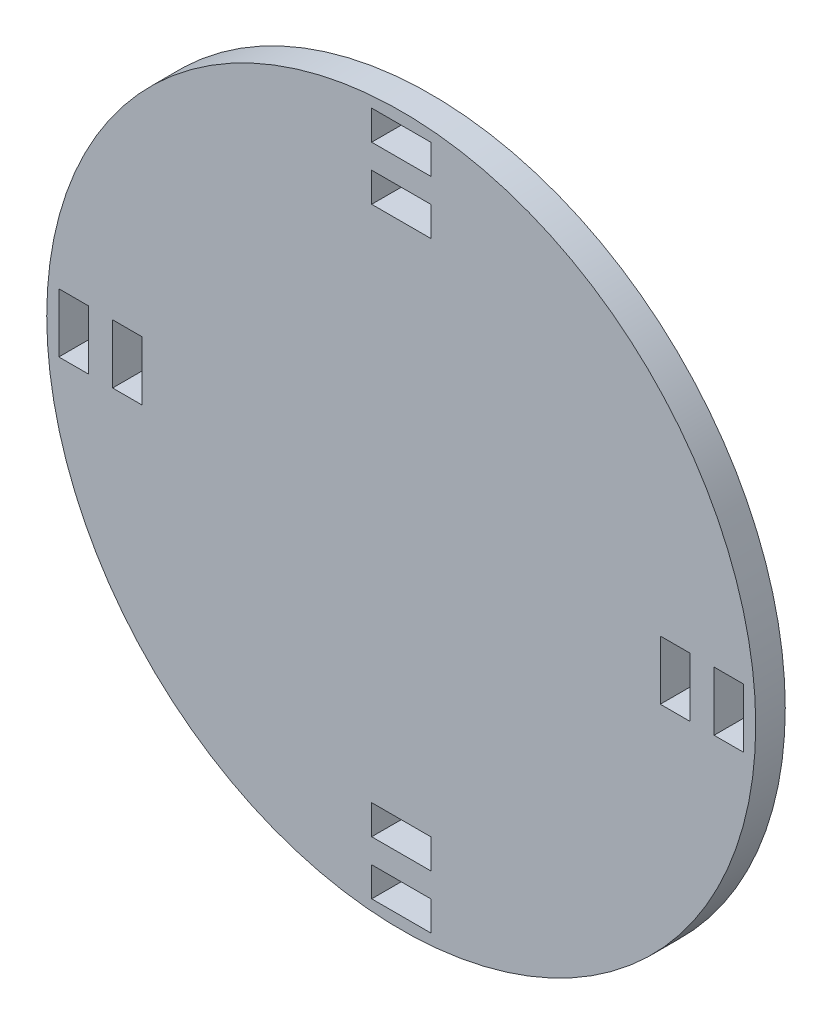
ISO-10303-21;
HEADER;
FILE_DESCRIPTION(('STEP AP214'),'2;1');
FILE_NAME('part.step','',(''),(''),'','','');
FILE_SCHEMA(('AUTOMOTIVE_DESIGN { 1 0 10303 214 1 1 1 1 }'));
ENDSEC;
DATA;
#1=APPLICATION_CONTEXT('core data for automotive mechanical design processes');
#2=APPLICATION_PROTOCOL_DEFINITION('international standard','automotive_design',2000,#1);
#3=PRODUCT_CONTEXT('',#1,'mechanical');
#4=PRODUCT('Part','Part','',(#3));
#5=PRODUCT_RELATED_PRODUCT_CATEGORY('part','',(#4));
#6=PRODUCT_DEFINITION_FORMATION('','',#4);
#7=PRODUCT_DEFINITION_CONTEXT('part definition',#1,'design');
#8=PRODUCT_DEFINITION('design','',#6,#7);
#9=PRODUCT_DEFINITION_SHAPE('','',#8);
#10=(LENGTH_UNIT() NAMED_UNIT(*) SI_UNIT(.MILLI.,.METRE.));
#11=(NAMED_UNIT(*) PLANE_ANGLE_UNIT() SI_UNIT($,.RADIAN.));
#12=(NAMED_UNIT(*) SI_UNIT($,.STERADIAN.) SOLID_ANGLE_UNIT());
#13=UNCERTAINTY_MEASURE_WITH_UNIT(LENGTH_MEASURE(1.E-05),#10,'distance_accuracy_value','');
#14=(GEOMETRIC_REPRESENTATION_CONTEXT(3) GLOBAL_UNCERTAINTY_ASSIGNED_CONTEXT((#13)) GLOBAL_UNIT_ASSIGNED_CONTEXT((#10,
#11,#12)) REPRESENTATION_CONTEXT('',''));
#15=CARTESIAN_POINT('',(0.,0.,0.));
#16=DIRECTION('',(0.,0.,1.));
#17=DIRECTION('',(1.,0.,0.));
#18=AXIS2_PLACEMENT_3D('',#15,#16,#17);
#19=CARTESIAN_POINT('',(0.,0.,6.35));
#20=DIRECTION('',(0.,0.,1.));
#21=DIRECTION('',(1.,0.,0.));
#22=AXIS2_PLACEMENT_3D('',#19,#20,#21);
#23=PLANE('',#22);
#24=DIRECTION('',(1.,0.,0.));
#25=VECTOR('',#24,1.);
#26=CARTESIAN_POINT('',(-73.5965,-6.35000000000026,6.35));
#27=LINE('',#26,#25);
#28=CARTESIAN_POINT('',(-73.5965,-6.35000000000026,6.35));
#29=VERTEX_POINT('',#28);
#30=CARTESIAN_POINT('',(-67.2465,-6.35000000000023,6.35));
#31=VERTEX_POINT('',#30);
#32=EDGE_CURVE('E55',#29,#31,#27,.T.);
#33=ORIENTED_EDGE('',*,*,#32,.F.);
#34=DIRECTION('',(0.,-1.,0.));
#35=VECTOR('',#34,1.);
#36=CARTESIAN_POINT('',(-73.5965,-6.35000000000026,6.35));
#37=LINE('',#36,#35);
#38=CARTESIAN_POINT('',(-73.5965,6.34999999999974,6.35));
#39=VERTEX_POINT('',#38);
#40=EDGE_CURVE('E258',#39,#29,#37,.T.);
#41=ORIENTED_EDGE('',*,*,#40,.F.);
#42=DIRECTION('',(-1.,0.,0.));
#43=VECTOR('',#42,1.);
#44=CARTESIAN_POINT('',(-73.5965,6.34999999999974,6.35));
#45=LINE('',#44,#43);
#46=CARTESIAN_POINT('',(-67.2465,6.34999999999976,6.35));
#47=VERTEX_POINT('',#46);
#48=EDGE_CURVE('E286',#47,#39,#45,.T.);
#49=ORIENTED_EDGE('',*,*,#48,.F.);
#50=DIRECTION('',(0.,1.,0.));
#51=VECTOR('',#50,1.);
#52=CARTESIAN_POINT('',(-67.2465,-6.35000000000023,6.35));
#53=LINE('',#52,#51);
#54=EDGE_CURVE('E278',#31,#47,#53,.T.);
#55=ORIENTED_EDGE('',*,*,#54,.F.);
#56=EDGE_LOOP('',(#33,#41,#49,#55));
#57=FACE_BOUND('',#56,.T.);
#58=DIRECTION('',(-1.,0.,0.));
#59=VECTOR('',#58,1.);
#60=CARTESIAN_POINT('',(62.0394999999999,6.35000000000065,6.35));
#61=LINE('',#60,#59);
#62=CARTESIAN_POINT('',(62.0394999999999,6.35000000000065,6.35));
#63=VERTEX_POINT('',#62);
#64=CARTESIAN_POINT('',(55.6894999999999,6.35000000000058,6.35));
#65=VERTEX_POINT('',#64);
#66=EDGE_CURVE('E63',#63,#65,#61,.T.);
#67=ORIENTED_EDGE('',*,*,#66,.F.);
#68=DIRECTION('',(0.,1.,0.));
#69=VECTOR('',#68,1.);
#70=CARTESIAN_POINT('',(62.0394999999999,6.35000000000065,6.35));
#71=LINE('',#70,#69);
#72=CARTESIAN_POINT('',(62.0395000000001,-6.34999999999935,6.35));
#73=VERTEX_POINT('',#72);
#74=EDGE_CURVE('E321',#73,#63,#71,.T.);
#75=ORIENTED_EDGE('',*,*,#74,.F.);
#76=DIRECTION('',(1.,0.,0.));
#77=VECTOR('',#76,1.);
#78=CARTESIAN_POINT('',(62.0395000000001,-6.34999999999935,6.35));
#79=LINE('',#78,#77);
#80=CARTESIAN_POINT('',(55.6895000000001,-6.34999999999941,6.35));
#81=VERTEX_POINT('',#80);
#82=EDGE_CURVE('E317',#81,#73,#79,.T.);
#83=ORIENTED_EDGE('',*,*,#82,.F.);
#84=DIRECTION('',(0.,-1.,0.));
#85=VECTOR('',#84,1.);
#86=CARTESIAN_POINT('',(55.6894999999999,6.35000000000058,6.35));
#87=LINE('',#86,#85);
#88=EDGE_CURVE('E313',#65,#81,#87,.T.);
#89=ORIENTED_EDGE('',*,*,#88,.F.);
#90=EDGE_LOOP('',(#67,#75,#83,#89));
#91=FACE_BOUND('',#90,.T.);
#92=DIRECTION('',(1.,0.,0.));
#93=VECTOR('',#92,1.);
#94=CARTESIAN_POINT('',(-62.0395,-6.35000000000022,6.35));
#95=LINE('',#94,#93);
#96=CARTESIAN_POINT('',(-62.0395,-6.35000000000022,6.35));
#97=VERTEX_POINT('',#96);
#98=CARTESIAN_POINT('',(-55.6895,-6.35000000000019,6.35));
#99=VERTEX_POINT('',#98);
#100=EDGE_CURVE('E440',#97,#99,#95,.T.);
#101=ORIENTED_EDGE('',*,*,#100,.F.);
#102=DIRECTION('',(0.,-1.,0.));
#103=VECTOR('',#102,1.);
#104=CARTESIAN_POINT('',(-62.0395,-6.35000000000022,6.35));
#105=LINE('',#104,#103);
#106=CARTESIAN_POINT('',(-62.0395,6.34999999999978,6.35));
#107=VERTEX_POINT('',#106);
#108=EDGE_CURVE('E451',#107,#97,#105,.T.);
#109=ORIENTED_EDGE('',*,*,#108,.F.);
#110=DIRECTION('',(-1.,0.,0.));
#111=VECTOR('',#110,1.);
#112=CARTESIAN_POINT('',(-62.0395,6.34999999999978,6.35));
#113=LINE('',#112,#111);
#114=CARTESIAN_POINT('',(-55.6895,6.3499999999998,6.35));
#115=VERTEX_POINT('',#114);
#116=EDGE_CURVE('E447',#115,#107,#113,.T.);
#117=ORIENTED_EDGE('',*,*,#116,.F.);
#118=DIRECTION('',(0.,1.,0.));
#119=VECTOR('',#118,1.);
#120=CARTESIAN_POINT('',(-55.6895,-6.35000000000019,6.35));
#121=LINE('',#120,#119);
#122=EDGE_CURVE('E443',#99,#115,#121,.T.);
#123=ORIENTED_EDGE('',*,*,#122,.F.);
#124=EDGE_LOOP('',(#101,#109,#117,#123));
#125=FACE_BOUND('',#124,.T.);
#126=DIRECTION('',(0.,1.,0.));
#127=VECTOR('',#126,1.);
#128=CARTESIAN_POINT('',(6.35,-73.5965,6.35));
#129=LINE('',#128,#127);
#130=CARTESIAN_POINT('',(6.35,-73.5965,6.35));
#131=VERTEX_POINT('',#130);
#132=CARTESIAN_POINT('',(6.35,-67.2465,6.35));
#133=VERTEX_POINT('',#132);
#134=EDGE_CURVE('E482',#131,#133,#129,.T.);
#135=ORIENTED_EDGE('',*,*,#134,.F.);
#136=DIRECTION('',(1.,0.,0.));
#137=VECTOR('',#136,1.);
#138=CARTESIAN_POINT('',(6.35,-73.5965,6.35));
#139=LINE('',#138,#137);
#140=CARTESIAN_POINT('',(-6.35,-73.5965,6.35));
#141=VERTEX_POINT('',#140);
#142=EDGE_CURVE('E493',#141,#131,#139,.T.);
#143=ORIENTED_EDGE('',*,*,#142,.F.);
#144=DIRECTION('',(0.,-1.,0.));
#145=VECTOR('',#144,1.);
#146=CARTESIAN_POINT('',(-6.35,-73.5965,6.35));
#147=LINE('',#146,#145);
#148=CARTESIAN_POINT('',(-6.35,-67.2465,6.35));
#149=VERTEX_POINT('',#148);
#150=EDGE_CURVE('E489',#149,#141,#147,.T.);
#151=ORIENTED_EDGE('',*,*,#150,.F.);
#152=DIRECTION('',(-1.,0.,0.));
#153=VECTOR('',#152,1.);
#154=CARTESIAN_POINT('',(6.35,-67.2465,6.35));
#155=LINE('',#154,#153);
#156=EDGE_CURVE('E485',#133,#149,#155,.T.);
#157=ORIENTED_EDGE('',*,*,#156,.F.);
#158=EDGE_LOOP('',(#135,#143,#151,#157));
#159=FACE_BOUND('',#158,.T.);
#160=DIRECTION('',(0.,1.,0.));
#161=VECTOR('',#160,1.);
#162=CARTESIAN_POINT('',(6.35,-62.0395,6.35));
#163=LINE('',#162,#161);
#164=CARTESIAN_POINT('',(6.35,-62.0395,6.35));
#165=VERTEX_POINT('',#164);
#166=CARTESIAN_POINT('',(6.35,-55.6895,6.35));
#167=VERTEX_POINT('',#166);
#168=EDGE_CURVE('E354',#165,#167,#163,.T.);
#169=ORIENTED_EDGE('',*,*,#168,.F.);
#170=DIRECTION('',(1.,0.,0.));
#171=VECTOR('',#170,1.);
#172=CARTESIAN_POINT('',(6.35,-62.0395,6.35));
#173=LINE('',#172,#171);
#174=CARTESIAN_POINT('',(-6.35,-62.0395,6.35));
#175=VERTEX_POINT('',#174);
#176=EDGE_CURVE('E365',#175,#165,#173,.T.);
#177=ORIENTED_EDGE('',*,*,#176,.F.);
#178=DIRECTION('',(0.,-1.,0.));
#179=VECTOR('',#178,1.);
#180=CARTESIAN_POINT('',(-6.35,-62.0395,6.35));
#181=LINE('',#180,#179);
#182=CARTESIAN_POINT('',(-6.35,-55.6895,6.35));
#183=VERTEX_POINT('',#182);
#184=EDGE_CURVE('E361',#183,#175,#181,.T.);
#185=ORIENTED_EDGE('',*,*,#184,.F.);
#186=DIRECTION('',(-1.,0.,0.));
#187=VECTOR('',#186,1.);
#188=CARTESIAN_POINT('',(6.35,-55.6895,6.35));
#189=LINE('',#188,#187);
#190=EDGE_CURVE('E357',#167,#183,#189,.T.);
#191=ORIENTED_EDGE('',*,*,#190,.F.);
#192=EDGE_LOOP('',(#169,#177,#185,#191));
#193=FACE_BOUND('',#192,.T.);
#194=DIRECTION('',(-1.,0.,0.));
#195=VECTOR('',#194,1.);
#196=CARTESIAN_POINT('',(73.5964999999999,6.35000000000077,6.35));
#197=LINE('',#196,#195);
#198=CARTESIAN_POINT('',(73.5964999999999,6.35000000000077,6.35));
#199=VERTEX_POINT('',#198);
#200=CARTESIAN_POINT('',(67.2464999999999,6.3500000000007,6.35));
#201=VERTEX_POINT('',#200);
#202=EDGE_CURVE('E397',#199,#201,#197,.T.);
#203=ORIENTED_EDGE('',*,*,#202,.F.);
#204=DIRECTION('',(0.,1.,0.));
#205=VECTOR('',#204,1.);
#206=CARTESIAN_POINT('',(73.5964999999999,6.35000000000077,6.35));
#207=LINE('',#206,#205);
#208=CARTESIAN_POINT('',(73.5965000000001,-6.34999999999923,6.35));
#209=VERTEX_POINT('',#208);
#210=EDGE_CURVE('E408',#209,#199,#207,.T.);
#211=ORIENTED_EDGE('',*,*,#210,.F.);
#212=DIRECTION('',(1.,0.,0.));
#213=VECTOR('',#212,1.);
#214=CARTESIAN_POINT('',(73.5965000000001,-6.34999999999923,6.35));
#215=LINE('',#214,#213);
#216=CARTESIAN_POINT('',(67.2465000000001,-6.3499999999993,6.35));
#217=VERTEX_POINT('',#216);
#218=EDGE_CURVE('E404',#217,#209,#215,.T.);
#219=ORIENTED_EDGE('',*,*,#218,.F.);
#220=DIRECTION('',(0.,-1.,0.));
#221=VECTOR('',#220,1.);
#222=CARTESIAN_POINT('',(67.2464999999999,6.3500000000007,6.35));
#223=LINE('',#222,#221);
#224=EDGE_CURVE('E400',#201,#217,#223,.T.);
#225=ORIENTED_EDGE('',*,*,#224,.F.);
#226=EDGE_LOOP('',(#203,#211,#219,#225));
#227=FACE_BOUND('',#226,.T.);
#228=DIRECTION('',(0.,-1.,0.));
#229=VECTOR('',#228,1.);
#230=CARTESIAN_POINT('',(-6.35,73.5965,6.35));
#231=LINE('',#230,#229);
#232=CARTESIAN_POINT('',(-6.35,73.5965,6.35));
#233=VERTEX_POINT('',#232);
#234=CARTESIAN_POINT('',(-6.35,67.2465,6.35));
#235=VERTEX_POINT('',#234);
#236=EDGE_CURVE('E525',#233,#235,#231,.T.);
#237=ORIENTED_EDGE('',*,*,#236,.F.);
#238=DIRECTION('',(-1.,0.,0.));
#239=VECTOR('',#238,1.);
#240=CARTESIAN_POINT('',(-6.35,73.5965,6.35));
#241=LINE('',#240,#239);
#242=CARTESIAN_POINT('',(6.35,73.5965,6.35));
#243=VERTEX_POINT('',#242);
#244=EDGE_CURVE('E536',#243,#233,#241,.T.);
#245=ORIENTED_EDGE('',*,*,#244,.F.);
#246=DIRECTION('',(0.,1.,0.));
#247=VECTOR('',#246,1.);
#248=CARTESIAN_POINT('',(6.35,73.5965,6.35));
#249=LINE('',#248,#247);
#250=CARTESIAN_POINT('',(6.35,67.2465,6.35));
#251=VERTEX_POINT('',#250);
#252=EDGE_CURVE('E532',#251,#243,#249,.T.);
#253=ORIENTED_EDGE('',*,*,#252,.F.);
#254=DIRECTION('',(1.,0.,0.));
#255=VECTOR('',#254,1.);
#256=CARTESIAN_POINT('',(-6.35,67.2465,6.35));
#257=LINE('',#256,#255);
#258=EDGE_CURVE('E528',#235,#251,#257,.T.);
#259=ORIENTED_EDGE('',*,*,#258,.F.);
#260=EDGE_LOOP('',(#237,#245,#253,#259));
#261=FACE_BOUND('',#260,.T.);
#262=DIRECTION('',(0.,-1.,0.));
#263=VECTOR('',#262,1.);
#264=CARTESIAN_POINT('',(-6.35,62.0395,6.35));
#265=LINE('',#264,#263);
#266=CARTESIAN_POINT('',(-6.35,62.0395,6.35));
#267=VERTEX_POINT('',#266);
#268=CARTESIAN_POINT('',(-6.35,55.6895,6.35));
#269=VERTEX_POINT('',#268);
#270=EDGE_CURVE('E567',#267,#269,#265,.T.);
#271=ORIENTED_EDGE('',*,*,#270,.F.);
#272=DIRECTION('',(-1.,0.,0.));
#273=VECTOR('',#272,1.);
#274=CARTESIAN_POINT('',(-6.35,62.0395,6.35));
#275=LINE('',#274,#273);
#276=CARTESIAN_POINT('',(6.35,62.0395,6.35));
#277=VERTEX_POINT('',#276);
#278=EDGE_CURVE('E578',#277,#267,#275,.T.);
#279=ORIENTED_EDGE('',*,*,#278,.F.);
#280=DIRECTION('',(0.,1.,0.));
#281=VECTOR('',#280,1.);
#282=CARTESIAN_POINT('',(6.35,62.0395,6.35));
#283=LINE('',#282,#281);
#284=CARTESIAN_POINT('',(6.35,55.6895,6.35));
#285=VERTEX_POINT('',#284);
#286=EDGE_CURVE('E574',#285,#277,#283,.T.);
#287=ORIENTED_EDGE('',*,*,#286,.F.);
#288=DIRECTION('',(1.,0.,0.));
#289=VECTOR('',#288,1.);
#290=CARTESIAN_POINT('',(-6.35,55.6895,6.35));
#291=LINE('',#290,#289);
#292=EDGE_CURVE('E570',#269,#285,#291,.T.);
#293=ORIENTED_EDGE('',*,*,#292,.F.);
#294=EDGE_LOOP('',(#271,#279,#287,#293));
#295=FACE_BOUND('',#294,.T.);
#296=CARTESIAN_POINT('',(0.,0.,6.35));
#297=DIRECTION('',(0.,0.,1.));
#298=DIRECTION('',(1.,0.,0.));
#299=AXIS2_PLACEMENT_3D('',#296,#297,#298);
#300=CIRCLE('',#299,76.2);
#301=CARTESIAN_POINT('',(76.2,0.,6.35));
#302=VERTEX_POINT('',#301);
#303=EDGE_CURVE('E11',#302,#302,#300,.T.);
#304=ORIENTED_EDGE('',*,*,#303,.T.);
#305=EDGE_LOOP('',(#304));
#306=FACE_BOUND('',#305,.T.);
#307=ADVANCED_FACE('F39',(#57,#91,#125,#159,#193,#227,#261,#295,#306),#23,.T.);
#308=CARTESIAN_POINT('',(0.,0.,0.));
#309=DIRECTION('',(0.,0.,1.));
#310=DIRECTION('',(1.,0.,0.));
#311=AXIS2_PLACEMENT_3D('',#308,#309,#310);
#312=PLANE('',#311);
#313=DIRECTION('',(0.,1.,0.));
#314=VECTOR('',#313,1.);
#315=CARTESIAN_POINT('',(-73.5965,-6.35000000000026,0.));
#316=LINE('',#315,#314);
#317=CARTESIAN_POINT('',(-73.5965,-6.35000000000026,0.));
#318=VERTEX_POINT('',#317);
#319=CARTESIAN_POINT('',(-73.5965,6.34999999999974,0.));
#320=VERTEX_POINT('',#319);
#321=EDGE_CURVE('E273',#318,#320,#316,.T.);
#322=ORIENTED_EDGE('',*,*,#321,.F.);
#323=DIRECTION('',(-1.,0.,0.));
#324=VECTOR('',#323,1.);
#325=CARTESIAN_POINT('',(-73.5965,-6.35000000000026,0.));
#326=LINE('',#325,#324);
#327=CARTESIAN_POINT('',(-67.2465,-6.35000000000023,0.));
#328=VERTEX_POINT('',#327);
#329=EDGE_CURVE('E251',#328,#318,#326,.T.);
#330=ORIENTED_EDGE('',*,*,#329,.F.);
#331=DIRECTION('',(0.,-1.,0.));
#332=VECTOR('',#331,1.);
#333=CARTESIAN_POINT('',(-67.2465,-6.35000000000023,0.));
#334=LINE('',#333,#332);
#335=CARTESIAN_POINT('',(-67.2465,6.34999999999976,0.));
#336=VERTEX_POINT('',#335);
#337=EDGE_CURVE('E262',#336,#328,#334,.T.);
#338=ORIENTED_EDGE('',*,*,#337,.F.);
#339=DIRECTION('',(1.,0.,0.));
#340=VECTOR('',#339,1.);
#341=CARTESIAN_POINT('',(-73.5965,6.34999999999974,0.));
#342=LINE('',#341,#340);
#343=EDGE_CURVE('E280',#320,#336,#342,.T.);
#344=ORIENTED_EDGE('',*,*,#343,.F.);
#345=EDGE_LOOP('',(#322,#330,#338,#344));
#346=FACE_BOUND('',#345,.T.);
#347=DIRECTION('',(0.,-1.,0.));
#348=VECTOR('',#347,1.);
#349=CARTESIAN_POINT('',(62.0394999999999,6.35000000000065,0.));
#350=LINE('',#349,#348);
#351=CARTESIAN_POINT('',(62.0394999999999,6.35000000000065,0.));
#352=VERTEX_POINT('',#351);
#353=CARTESIAN_POINT('',(62.0395000000001,-6.34999999999935,0.));
#354=VERTEX_POINT('',#353);
#355=EDGE_CURVE('E303',#352,#354,#350,.T.);
#356=ORIENTED_EDGE('',*,*,#355,.F.);
#357=DIRECTION('',(1.,0.,0.));
#358=VECTOR('',#357,1.);
#359=CARTESIAN_POINT('',(62.0394999999999,6.35000000000065,0.));
#360=LINE('',#359,#358);
#361=CARTESIAN_POINT('',(55.6894999999999,6.35000000000058,0.));
#362=VERTEX_POINT('',#361);
#363=EDGE_CURVE('E307',#362,#352,#360,.T.);
#364=ORIENTED_EDGE('',*,*,#363,.F.);
#365=DIRECTION('',(0.,1.,0.));
#366=VECTOR('',#365,1.);
#367=CARTESIAN_POINT('',(55.6894999999999,6.35000000000058,0.));
#368=LINE('',#367,#366);
#369=CARTESIAN_POINT('',(55.6895000000001,-6.34999999999941,0.));
#370=VERTEX_POINT('',#369);
#371=EDGE_CURVE('E329',#370,#362,#368,.T.);
#372=ORIENTED_EDGE('',*,*,#371,.F.);
#373=DIRECTION('',(-1.,0.,0.));
#374=VECTOR('',#373,1.);
#375=CARTESIAN_POINT('',(62.0395000000001,-6.34999999999935,0.));
#376=LINE('',#375,#374);
#377=EDGE_CURVE('E300',#354,#370,#376,.T.);
#378=ORIENTED_EDGE('',*,*,#377,.F.);
#379=EDGE_LOOP('',(#356,#364,#372,#378));
#380=FACE_BOUND('',#379,.T.);
#381=DIRECTION('',(0.,1.,0.));
#382=VECTOR('',#381,1.);
#383=CARTESIAN_POINT('',(-62.0395,-6.35000000000022,0.));
#384=LINE('',#383,#382);
#385=CARTESIAN_POINT('',(-62.0395,-6.35000000000022,0.));
#386=VERTEX_POINT('',#385);
#387=CARTESIAN_POINT('',(-62.0395,6.34999999999978,0.));
#388=VERTEX_POINT('',#387);
#389=EDGE_CURVE('E431',#386,#388,#384,.T.);
#390=ORIENTED_EDGE('',*,*,#389,.F.);
#391=DIRECTION('',(-1.,0.,0.));
#392=VECTOR('',#391,1.);
#393=CARTESIAN_POINT('',(-62.0395,-6.35000000000022,0.));
#394=LINE('',#393,#392);
#395=CARTESIAN_POINT('',(-55.6895,-6.35000000000019,0.));
#396=VERTEX_POINT('',#395);
#397=EDGE_CURVE('E436',#396,#386,#394,.T.);
#398=ORIENTED_EDGE('',*,*,#397,.F.);
#399=DIRECTION('',(0.,-1.,0.));
#400=VECTOR('',#399,1.);
#401=CARTESIAN_POINT('',(-55.6895,-6.35000000000019,0.));
#402=LINE('',#401,#400);
#403=CARTESIAN_POINT('',(-55.6895,6.3499999999998,0.));
#404=VERTEX_POINT('',#403);
#405=EDGE_CURVE('E459',#404,#396,#402,.T.);
#406=ORIENTED_EDGE('',*,*,#405,.F.);
#407=DIRECTION('',(1.,0.,0.));
#408=VECTOR('',#407,1.);
#409=CARTESIAN_POINT('',(-62.0395,6.34999999999978,0.));
#410=LINE('',#409,#408);
#411=EDGE_CURVE('E428',#388,#404,#410,.T.);
#412=ORIENTED_EDGE('',*,*,#411,.F.);
#413=EDGE_LOOP('',(#390,#398,#406,#412));
#414=FACE_BOUND('',#413,.T.);
#415=DIRECTION('',(-1.,0.,0.));
#416=VECTOR('',#415,1.);
#417=CARTESIAN_POINT('',(6.35,-73.5965,0.));
#418=LINE('',#417,#416);
#419=CARTESIAN_POINT('',(6.35,-73.5965,0.));
#420=VERTEX_POINT('',#419);
#421=CARTESIAN_POINT('',(-6.35,-73.5965,0.));
#422=VERTEX_POINT('',#421);
#423=EDGE_CURVE('E474',#420,#422,#418,.T.);
#424=ORIENTED_EDGE('',*,*,#423,.F.);
#425=DIRECTION('',(0.,-1.,0.));
#426=VECTOR('',#425,1.);
#427=CARTESIAN_POINT('',(6.35,-73.5965,0.));
#428=LINE('',#427,#426);
#429=CARTESIAN_POINT('',(6.35,-67.2465,0.));
#430=VERTEX_POINT('',#429);
#431=EDGE_CURVE('E478',#430,#420,#428,.T.);
#432=ORIENTED_EDGE('',*,*,#431,.F.);
#433=DIRECTION('',(1.,0.,0.));
#434=VECTOR('',#433,1.);
#435=CARTESIAN_POINT('',(6.35,-67.2465,0.));
#436=LINE('',#435,#434);
#437=CARTESIAN_POINT('',(-6.35,-67.2465,0.));
#438=VERTEX_POINT('',#437);
#439=EDGE_CURVE('E432',#438,#430,#436,.T.);
#440=ORIENTED_EDGE('',*,*,#439,.F.);
#441=DIRECTION('',(0.,1.,0.));
#442=VECTOR('',#441,1.);
#443=CARTESIAN_POINT('',(-6.35,-73.5965,0.));
#444=LINE('',#443,#442);
#445=EDGE_CURVE('E386',#422,#438,#444,.T.);
#446=ORIENTED_EDGE('',*,*,#445,.F.);
#447=EDGE_LOOP('',(#424,#432,#440,#446));
#448=FACE_BOUND('',#447,.T.);
#449=DIRECTION('',(-1.,0.,0.));
#450=VECTOR('',#449,1.);
#451=CARTESIAN_POINT('',(6.35,-62.0395,0.));
#452=LINE('',#451,#450);
#453=CARTESIAN_POINT('',(6.35,-62.0395,0.));
#454=VERTEX_POINT('',#453);
#455=CARTESIAN_POINT('',(-6.35,-62.0395,0.));
#456=VERTEX_POINT('',#455);
#457=EDGE_CURVE('E345',#454,#456,#452,.T.);
#458=ORIENTED_EDGE('',*,*,#457,.F.);
#459=DIRECTION('',(0.,-1.,0.));
#460=VECTOR('',#459,1.);
#461=CARTESIAN_POINT('',(6.35,-62.0395,0.));
#462=LINE('',#461,#460);
#463=CARTESIAN_POINT('',(6.35,-55.6895,0.));
#464=VERTEX_POINT('',#463);
#465=EDGE_CURVE('E350',#464,#454,#462,.T.);
#466=ORIENTED_EDGE('',*,*,#465,.F.);
#467=DIRECTION('',(1.,0.,0.));
#468=VECTOR('',#467,1.);
#469=CARTESIAN_POINT('',(6.35,-55.6895,0.));
#470=LINE('',#469,#468);
#471=CARTESIAN_POINT('',(-6.35,-55.6895,0.));
#472=VERTEX_POINT('',#471);
#473=EDGE_CURVE('E373',#472,#464,#470,.T.);
#474=ORIENTED_EDGE('',*,*,#473,.F.);
#475=DIRECTION('',(0.,1.,0.));
#476=VECTOR('',#475,1.);
#477=CARTESIAN_POINT('',(-6.35,-62.0395,0.));
#478=LINE('',#477,#476);
#479=EDGE_CURVE('E342',#456,#472,#478,.T.);
#480=ORIENTED_EDGE('',*,*,#479,.F.);
#481=EDGE_LOOP('',(#458,#466,#474,#480));
#482=FACE_BOUND('',#481,.T.);
#483=DIRECTION('',(0.,-1.,0.));
#484=VECTOR('',#483,1.);
#485=CARTESIAN_POINT('',(73.5964999999999,6.35000000000077,0.));
#486=LINE('',#485,#484);
#487=CARTESIAN_POINT('',(73.5964999999999,6.35000000000077,0.));
#488=VERTEX_POINT('',#487);
#489=CARTESIAN_POINT('',(73.5965000000001,-6.34999999999923,0.));
#490=VERTEX_POINT('',#489);
#491=EDGE_CURVE('E389',#488,#490,#486,.T.);
#492=ORIENTED_EDGE('',*,*,#491,.F.);
#493=DIRECTION('',(1.,0.,0.));
#494=VECTOR('',#493,1.);
#495=CARTESIAN_POINT('',(73.5964999999999,6.35000000000077,0.));
#496=LINE('',#495,#494);
#497=CARTESIAN_POINT('',(67.2464999999999,6.3500000000007,0.));
#498=VERTEX_POINT('',#497);
#499=EDGE_CURVE('E393',#498,#488,#496,.T.);
#500=ORIENTED_EDGE('',*,*,#499,.F.);
#501=DIRECTION('',(0.,1.,0.));
#502=VECTOR('',#501,1.);
#503=CARTESIAN_POINT('',(67.2464999999999,6.3500000000007,0.));
#504=LINE('',#503,#502);
#505=CARTESIAN_POINT('',(67.2465000000001,-6.3499999999993,0.));
#506=VERTEX_POINT('',#505);
#507=EDGE_CURVE('E346',#506,#498,#504,.T.);
#508=ORIENTED_EDGE('',*,*,#507,.F.);
#509=DIRECTION('',(-1.,0.,0.));
#510=VECTOR('',#509,1.);
#511=CARTESIAN_POINT('',(73.5965000000001,-6.34999999999923,0.));
#512=LINE('',#511,#510);
#513=EDGE_CURVE('E341',#490,#506,#512,.T.);
#514=ORIENTED_EDGE('',*,*,#513,.F.);
#515=EDGE_LOOP('',(#492,#500,#508,#514));
#516=FACE_BOUND('',#515,.T.);
#517=DIRECTION('',(1.,0.,0.));
#518=VECTOR('',#517,1.);
#519=CARTESIAN_POINT('',(-6.35,73.5965,0.));
#520=LINE('',#519,#518);
#521=CARTESIAN_POINT('',(-6.35,73.5965,0.));
#522=VERTEX_POINT('',#521);
#523=CARTESIAN_POINT('',(6.35,73.5965,0.));
#524=VERTEX_POINT('',#523);
#525=EDGE_CURVE('E516',#522,#524,#520,.T.);
#526=ORIENTED_EDGE('',*,*,#525,.F.);
#527=DIRECTION('',(0.,1.,0.));
#528=VECTOR('',#527,1.);
#529=CARTESIAN_POINT('',(-6.35,73.5965,0.));
#530=LINE('',#529,#528);
#531=CARTESIAN_POINT('',(-6.35,67.2465,0.));
#532=VERTEX_POINT('',#531);
#533=EDGE_CURVE('E521',#532,#522,#530,.T.);
#534=ORIENTED_EDGE('',*,*,#533,.F.);
#535=DIRECTION('',(-1.,0.,0.));
#536=VECTOR('',#535,1.);
#537=CARTESIAN_POINT('',(-6.35,67.2465,0.));
#538=LINE('',#537,#536);
#539=CARTESIAN_POINT('',(6.35,67.2465,0.));
#540=VERTEX_POINT('',#539);
#541=EDGE_CURVE('E544',#540,#532,#538,.T.);
#542=ORIENTED_EDGE('',*,*,#541,.F.);
#543=DIRECTION('',(0.,-1.,0.));
#544=VECTOR('',#543,1.);
#545=CARTESIAN_POINT('',(6.35,73.5965,0.));
#546=LINE('',#545,#544);
#547=EDGE_CURVE('E513',#524,#540,#546,.T.);
#548=ORIENTED_EDGE('',*,*,#547,.F.);
#549=EDGE_LOOP('',(#526,#534,#542,#548));
#550=FACE_BOUND('',#549,.T.);
#551=DIRECTION('',(1.,0.,0.));
#552=VECTOR('',#551,1.);
#553=CARTESIAN_POINT('',(-6.35,62.0395,0.));
#554=LINE('',#553,#552);
#555=CARTESIAN_POINT('',(-6.35,62.0395,0.));
#556=VERTEX_POINT('',#555);
#557=CARTESIAN_POINT('',(6.35,62.0395,0.));
#558=VERTEX_POINT('',#557);
#559=EDGE_CURVE('E559',#556,#558,#554,.T.);
#560=ORIENTED_EDGE('',*,*,#559,.F.);
#561=DIRECTION('',(0.,1.,0.));
#562=VECTOR('',#561,1.);
#563=CARTESIAN_POINT('',(-6.35,62.0395,0.));
#564=LINE('',#563,#562);
#565=CARTESIAN_POINT('',(-6.35,55.6895,0.));
#566=VERTEX_POINT('',#565);
#567=EDGE_CURVE('E563',#566,#556,#564,.T.);
#568=ORIENTED_EDGE('',*,*,#567,.F.);
#569=DIRECTION('',(-1.,0.,0.));
#570=VECTOR('',#569,1.);
#571=CARTESIAN_POINT('',(-6.35,55.6895,0.));
#572=LINE('',#571,#570);
#573=CARTESIAN_POINT('',(6.35,55.6895,0.));
#574=VERTEX_POINT('',#573);
#575=EDGE_CURVE('E517',#574,#566,#572,.T.);
#576=ORIENTED_EDGE('',*,*,#575,.F.);
#577=DIRECTION('',(0.,-1.,0.));
#578=VECTOR('',#577,1.);
#579=CARTESIAN_POINT('',(6.35,62.0395,0.));
#580=LINE('',#579,#578);
#581=EDGE_CURVE('E267',#558,#574,#580,.T.);
#582=ORIENTED_EDGE('',*,*,#581,.F.);
#583=EDGE_LOOP('',(#560,#568,#576,#582));
#584=FACE_BOUND('',#583,.T.);
#585=CARTESIAN_POINT('',(0.,0.,0.));
#586=DIRECTION('',(0.,0.,1.));
#587=DIRECTION('',(1.,0.,0.));
#588=AXIS2_PLACEMENT_3D('',#585,#586,#587);
#589=CIRCLE('',#588,76.2);
#590=CARTESIAN_POINT('',(76.2,0.,0.));
#591=VERTEX_POINT('',#590);
#592=EDGE_CURVE('E43',#591,#591,#589,.T.);
#593=ORIENTED_EDGE('',*,*,#592,.F.);
#594=EDGE_LOOP('',(#593));
#595=FACE_BOUND('',#594,.T.);
#596=ADVANCED_FACE('F270',(#346,#380,#414,#448,#482,#516,#550,#584,#595),#312,.F.);
#597=CARTESIAN_POINT('',(0.,0.,6.35));
#598=DIRECTION('',(0.,0.,-1.));
#599=DIRECTION('',(-1.,0.,0.));
#600=AXIS2_PLACEMENT_3D('',#597,#598,#599);
#601=CYLINDRICAL_SURFACE('',#600,76.2);
#602=ORIENTED_EDGE('',*,*,#303,.F.);
#603=EDGE_LOOP('',(#602));
#604=FACE_BOUND('',#603,.T.);
#605=ORIENTED_EDGE('',*,*,#592,.T.);
#606=EDGE_LOOP('',(#605));
#607=FACE_BOUND('',#606,.T.);
#608=ADVANCED_FACE('F41',(#604,#607),#601,.T.);
#609=CARTESIAN_POINT('',(-6.35,62.0395,-0.00100000000000013));
#610=DIRECTION('',(-1.,0.,0.));
#611=DIRECTION('',(0.,0.,1.));
#612=AXIS2_PLACEMENT_3D('',#609,#610,#611);
#613=PLANE('',#612);
#614=ORIENTED_EDGE('',*,*,#567,.T.);
#615=DIRECTION('',(0.,0.,1.));
#616=VECTOR('',#615,1.);
#617=CARTESIAN_POINT('',(-6.35,62.0395,-0.00100000000000013));
#618=LINE('',#617,#616);
#619=EDGE_CURVE('E583',#556,#267,#618,.T.);
#620=ORIENTED_EDGE('',*,*,#619,.T.);
#621=ORIENTED_EDGE('',*,*,#270,.T.);
#622=DIRECTION('',(0.,0.,1.));
#623=VECTOR('',#622,1.);
#624=CARTESIAN_POINT('',(-6.35,55.6895,-0.00100000000000013));
#625=LINE('',#624,#623);
#626=EDGE_CURVE('E582',#566,#269,#625,.T.);
#627=ORIENTED_EDGE('',*,*,#626,.F.);
#628=EDGE_LOOP('',(#614,#620,#621,#627));
#629=FACE_BOUND('',#628,.T.);
#630=ADVANCED_FACE('F608',(#629),#613,.F.);
#631=CARTESIAN_POINT('',(-6.35,62.0395,-0.00100000000000013));
#632=DIRECTION('',(0.,1.,0.));
#633=DIRECTION('',(0.,0.,1.));
#634=AXIS2_PLACEMENT_3D('',#631,#632,#633);
#635=PLANE('',#634);
#636=ORIENTED_EDGE('',*,*,#559,.T.);
#637=DIRECTION('',(0.,0.,1.));
#638=VECTOR('',#637,1.);
#639=CARTESIAN_POINT('',(6.35,62.0395,-0.00100000000000013));
#640=LINE('',#639,#638);
#641=EDGE_CURVE('E586',#558,#277,#640,.T.);
#642=ORIENTED_EDGE('',*,*,#641,.T.);
#643=ORIENTED_EDGE('',*,*,#278,.T.);
#644=ORIENTED_EDGE('',*,*,#619,.F.);
#645=EDGE_LOOP('',(#636,#642,#643,#644));
#646=FACE_BOUND('',#645,.T.);
#647=ADVANCED_FACE('F617',(#646),#635,.F.);
#648=CARTESIAN_POINT('',(6.35,62.0395,-0.00100000000000013));
#649=DIRECTION('',(1.,0.,0.));
#650=DIRECTION('',(0.,0.,-1.));
#651=AXIS2_PLACEMENT_3D('',#648,#649,#650);
#652=PLANE('',#651);
#653=ORIENTED_EDGE('',*,*,#581,.T.);
#654=DIRECTION('',(0.,0.,1.));
#655=VECTOR('',#654,1.);
#656=CARTESIAN_POINT('',(6.35,55.6895,-0.00100000000000013));
#657=LINE('',#656,#655);
#658=EDGE_CURVE('E589',#574,#285,#657,.T.);
#659=ORIENTED_EDGE('',*,*,#658,.T.);
#660=ORIENTED_EDGE('',*,*,#286,.T.);
#661=ORIENTED_EDGE('',*,*,#641,.F.);
#662=EDGE_LOOP('',(#653,#659,#660,#661));
#663=FACE_BOUND('',#662,.T.);
#664=ADVANCED_FACE('F615',(#663),#652,.F.);
#665=CARTESIAN_POINT('',(-6.35,55.6895,-0.00100000000000013));
#666=DIRECTION('',(0.,-1.,0.));
#667=DIRECTION('',(1.,0.,0.));
#668=AXIS2_PLACEMENT_3D('',#665,#666,#667);
#669=PLANE('',#668);
#670=ORIENTED_EDGE('',*,*,#575,.T.);
#671=ORIENTED_EDGE('',*,*,#626,.T.);
#672=ORIENTED_EDGE('',*,*,#292,.T.);
#673=ORIENTED_EDGE('',*,*,#658,.F.);
#674=EDGE_LOOP('',(#670,#671,#672,#673));
#675=FACE_BOUND('',#674,.T.);
#676=ADVANCED_FACE('F601',(#675),#669,.F.);
#677=CARTESIAN_POINT('',(-6.35,73.5965,-0.00100000000000013));
#678=DIRECTION('',(-1.,0.,0.));
#679=DIRECTION('',(0.,-1.,0.));
#680=AXIS2_PLACEMENT_3D('',#677,#678,#679);
#681=PLANE('',#680);
#682=ORIENTED_EDGE('',*,*,#533,.T.);
#683=DIRECTION('',(0.,0.,1.));
#684=VECTOR('',#683,1.);
#685=CARTESIAN_POINT('',(-6.35,73.5965,-0.00100000000000013));
#686=LINE('',#685,#684);
#687=EDGE_CURVE('E541',#522,#233,#686,.T.);
#688=ORIENTED_EDGE('',*,*,#687,.T.);
#689=ORIENTED_EDGE('',*,*,#236,.T.);
#690=DIRECTION('',(0.,0.,1.));
#691=VECTOR('',#690,1.);
#692=CARTESIAN_POINT('',(-6.35,67.2465,-0.00100000000000013));
#693=LINE('',#692,#691);
#694=EDGE_CURVE('E540',#532,#235,#693,.T.);
#695=ORIENTED_EDGE('',*,*,#694,.F.);
#696=EDGE_LOOP('',(#682,#688,#689,#695));
#697=FACE_BOUND('',#696,.T.);
#698=ADVANCED_FACE('F636',(#697),#681,.F.);
#699=CARTESIAN_POINT('',(-6.35,73.5965,-0.00100000000000013));
#700=DIRECTION('',(0.,1.,0.));
#701=DIRECTION('',(0.,0.,1.));
#702=AXIS2_PLACEMENT_3D('',#699,#700,#701);
#703=PLANE('',#702);
#704=ORIENTED_EDGE('',*,*,#525,.T.);
#705=DIRECTION('',(0.,0.,1.));
#706=VECTOR('',#705,1.);
#707=CARTESIAN_POINT('',(6.35,73.5965,-0.00100000000000013));
#708=LINE('',#707,#706);
#709=EDGE_CURVE('E545',#524,#243,#708,.T.);
#710=ORIENTED_EDGE('',*,*,#709,.T.);
#711=ORIENTED_EDGE('',*,*,#244,.T.);
#712=ORIENTED_EDGE('',*,*,#687,.F.);
#713=EDGE_LOOP('',(#704,#710,#711,#712));
#714=FACE_BOUND('',#713,.T.);
#715=ADVANCED_FACE('F640',(#714),#703,.F.);
#716=CARTESIAN_POINT('',(6.35,73.5965,-0.00100000000000013));
#717=DIRECTION('',(1.,0.,0.));
#718=DIRECTION('',(0.,0.,-1.));
#719=AXIS2_PLACEMENT_3D('',#716,#717,#718);
#720=PLANE('',#719);
#721=ORIENTED_EDGE('',*,*,#547,.T.);
#722=DIRECTION('',(0.,0.,1.));
#723=VECTOR('',#722,1.);
#724=CARTESIAN_POINT('',(6.35,67.2465,-0.00100000000000013));
#725=LINE('',#724,#723);
#726=EDGE_CURVE('E548',#540,#251,#725,.T.);
#727=ORIENTED_EDGE('',*,*,#726,.T.);
#728=ORIENTED_EDGE('',*,*,#252,.T.);
#729=ORIENTED_EDGE('',*,*,#709,.F.);
#730=EDGE_LOOP('',(#721,#727,#728,#729));
#731=FACE_BOUND('',#730,.T.);
#732=ADVANCED_FACE('F645',(#731),#720,.F.);
#733=CARTESIAN_POINT('',(-6.35,67.2465,-0.00100000000000013));
#734=DIRECTION('',(0.,-1.,0.));
#735=DIRECTION('',(0.,0.,-1.));
#736=AXIS2_PLACEMENT_3D('',#733,#734,#735);
#737=PLANE('',#736);
#738=ORIENTED_EDGE('',*,*,#541,.T.);
#739=ORIENTED_EDGE('',*,*,#694,.T.);
#740=ORIENTED_EDGE('',*,*,#258,.T.);
#741=ORIENTED_EDGE('',*,*,#726,.F.);
#742=EDGE_LOOP('',(#738,#739,#740,#741));
#743=FACE_BOUND('',#742,.T.);
#744=ADVANCED_FACE('F649',(#743),#737,.F.);
#745=CARTESIAN_POINT('',(73.5964999999999,6.35000000000077,-0.00100000000000013));
#746=DIRECTION('',(0.,1.,0.));
#747=DIRECTION('',(-1.,0.,0.));
#748=AXIS2_PLACEMENT_3D('',#745,#746,#747);
#749=PLANE('',#748);
#750=ORIENTED_EDGE('',*,*,#499,.T.);
#751=DIRECTION('',(0.,0.,1.));
#752=VECTOR('',#751,1.);
#753=CARTESIAN_POINT('',(73.5964999999999,6.35000000000077,-0.00100000000000013));
#754=LINE('',#753,#752);
#755=EDGE_CURVE('E413',#488,#199,#754,.T.);
#756=ORIENTED_EDGE('',*,*,#755,.T.);
#757=ORIENTED_EDGE('',*,*,#202,.T.);
#758=DIRECTION('',(0.,0.,1.));
#759=VECTOR('',#758,1.);
#760=CARTESIAN_POINT('',(67.2464999999999,6.3500000000007,-0.00100000000000013));
#761=LINE('',#760,#759);
#762=EDGE_CURVE('E412',#498,#201,#761,.T.);
#763=ORIENTED_EDGE('',*,*,#762,.F.);
#764=EDGE_LOOP('',(#750,#756,#757,#763));
#765=FACE_BOUND('',#764,.T.);
#766=ADVANCED_FACE('F652',(#765),#749,.F.);
#767=CARTESIAN_POINT('',(73.5964999999999,6.35000000000077,-0.00100000000000013));
#768=DIRECTION('',(1.,0.,0.));
#769=DIRECTION('',(0.,1.,0.));
#770=AXIS2_PLACEMENT_3D('',#767,#768,#769);
#771=PLANE('',#770);
#772=ORIENTED_EDGE('',*,*,#491,.T.);
#773=DIRECTION('',(0.,0.,1.));
#774=VECTOR('',#773,1.);
#775=CARTESIAN_POINT('',(73.5965000000001,-6.34999999999923,-0.00100000000000013));
#776=LINE('',#775,#774);
#777=EDGE_CURVE('E416',#490,#209,#776,.T.);
#778=ORIENTED_EDGE('',*,*,#777,.T.);
#779=ORIENTED_EDGE('',*,*,#210,.T.);
#780=ORIENTED_EDGE('',*,*,#755,.F.);
#781=EDGE_LOOP('',(#772,#778,#779,#780));
#782=FACE_BOUND('',#781,.T.);
#783=ADVANCED_FACE('F693',(#782),#771,.F.);
#784=CARTESIAN_POINT('',(73.5965000000001,-6.34999999999923,-0.00100000000000013));
#785=DIRECTION('',(0.,-1.,0.));
#786=DIRECTION('',(1.,0.,0.));
#787=AXIS2_PLACEMENT_3D('',#784,#785,#786);
#788=PLANE('',#787);
#789=ORIENTED_EDGE('',*,*,#513,.T.);
#790=DIRECTION('',(0.,0.,1.));
#791=VECTOR('',#790,1.);
#792=CARTESIAN_POINT('',(67.2465000000001,-6.3499999999993,-0.00100000000000013));
#793=LINE('',#792,#791);
#794=EDGE_CURVE('E419',#506,#217,#793,.T.);
#795=ORIENTED_EDGE('',*,*,#794,.T.);
#796=ORIENTED_EDGE('',*,*,#218,.T.);
#797=ORIENTED_EDGE('',*,*,#777,.F.);
#798=EDGE_LOOP('',(#789,#795,#796,#797));
#799=FACE_BOUND('',#798,.T.);
#800=ADVANCED_FACE('F699',(#799),#788,.F.);
#801=CARTESIAN_POINT('',(67.2464999999999,6.3500000000007,-0.00100000000000013));
#802=DIRECTION('',(-1.,0.,0.));
#803=DIRECTION('',(0.,-1.,0.));
#804=AXIS2_PLACEMENT_3D('',#801,#802,#803);
#805=PLANE('',#804);
#806=ORIENTED_EDGE('',*,*,#507,.T.);
#807=ORIENTED_EDGE('',*,*,#762,.T.);
#808=ORIENTED_EDGE('',*,*,#224,.T.);
#809=ORIENTED_EDGE('',*,*,#794,.F.);
#810=EDGE_LOOP('',(#806,#807,#808,#809));
#811=FACE_BOUND('',#810,.T.);
#812=ADVANCED_FACE('F695',(#811),#805,.F.);
#813=CARTESIAN_POINT('',(6.35,-62.0395,-0.00100000000000013));
#814=DIRECTION('',(1.,0.,0.));
#815=DIRECTION('',(0.,0.,-1.));
#816=AXIS2_PLACEMENT_3D('',#813,#814,#815);
#817=PLANE('',#816);
#818=ORIENTED_EDGE('',*,*,#465,.T.);
#819=DIRECTION('',(0.,0.,1.));
#820=VECTOR('',#819,1.);
#821=CARTESIAN_POINT('',(6.35,-62.0395,-0.00100000000000013));
#822=LINE('',#821,#820);
#823=EDGE_CURVE('E370',#454,#165,#822,.T.);
#824=ORIENTED_EDGE('',*,*,#823,.T.);
#825=ORIENTED_EDGE('',*,*,#168,.T.);
#826=DIRECTION('',(0.,0.,1.));
#827=VECTOR('',#826,1.);
#828=CARTESIAN_POINT('',(6.35,-55.6895,-0.00100000000000013));
#829=LINE('',#828,#827);
#830=EDGE_CURVE('E369',#464,#167,#829,.T.);
#831=ORIENTED_EDGE('',*,*,#830,.F.);
#832=EDGE_LOOP('',(#818,#824,#825,#831));
#833=FACE_BOUND('',#832,.T.);
#834=ADVANCED_FACE('F698',(#833),#817,.F.);
#835=CARTESIAN_POINT('',(6.35,-62.0395,-0.00100000000000013));
#836=DIRECTION('',(0.,-1.,0.));
#837=DIRECTION('',(0.,0.,-1.));
#838=AXIS2_PLACEMENT_3D('',#835,#836,#837);
#839=PLANE('',#838);
#840=ORIENTED_EDGE('',*,*,#457,.T.);
#841=DIRECTION('',(0.,0.,1.));
#842=VECTOR('',#841,1.);
#843=CARTESIAN_POINT('',(-6.35,-62.0395,-0.00100000000000013));
#844=LINE('',#843,#842);
#845=EDGE_CURVE('E374',#456,#175,#844,.T.);
#846=ORIENTED_EDGE('',*,*,#845,.T.);
#847=ORIENTED_EDGE('',*,*,#176,.T.);
#848=ORIENTED_EDGE('',*,*,#823,.F.);
#849=EDGE_LOOP('',(#840,#846,#847,#848));
#850=FACE_BOUND('',#849,.T.);
#851=ADVANCED_FACE('F709',(#850),#839,.F.);
#852=CARTESIAN_POINT('',(-6.35,-62.0395,-0.00100000000000013));
#853=DIRECTION('',(-1.,0.,0.));
#854=DIRECTION('',(0.,0.,1.));
#855=AXIS2_PLACEMENT_3D('',#852,#853,#854);
#856=PLANE('',#855);
#857=ORIENTED_EDGE('',*,*,#479,.T.);
#858=DIRECTION('',(0.,0.,1.));
#859=VECTOR('',#858,1.);
#860=CARTESIAN_POINT('',(-6.35,-55.6895,-0.00100000000000013));
#861=LINE('',#860,#859);
#862=EDGE_CURVE('E377',#472,#183,#861,.T.);
#863=ORIENTED_EDGE('',*,*,#862,.T.);
#864=ORIENTED_EDGE('',*,*,#184,.T.);
#865=ORIENTED_EDGE('',*,*,#845,.F.);
#866=EDGE_LOOP('',(#857,#863,#864,#865));
#867=FACE_BOUND('',#866,.T.);
#868=ADVANCED_FACE('F713',(#867),#856,.F.);
#869=CARTESIAN_POINT('',(6.35,-55.6895,-0.00100000000000013));
#870=DIRECTION('',(0.,1.,0.));
#871=DIRECTION('',(-1.,0.,0.));
#872=AXIS2_PLACEMENT_3D('',#869,#870,#871);
#873=PLANE('',#872);
#874=ORIENTED_EDGE('',*,*,#473,.T.);
#875=ORIENTED_EDGE('',*,*,#830,.T.);
#876=ORIENTED_EDGE('',*,*,#190,.T.);
#877=ORIENTED_EDGE('',*,*,#862,.F.);
#878=EDGE_LOOP('',(#874,#875,#876,#877));
#879=FACE_BOUND('',#878,.T.);
#880=ADVANCED_FACE('F661',(#879),#873,.F.);
#881=CARTESIAN_POINT('',(6.35,-73.5965,-0.00100000000000013));
#882=DIRECTION('',(1.,0.,0.));
#883=DIRECTION('',(0.,1.,0.));
#884=AXIS2_PLACEMENT_3D('',#881,#882,#883);
#885=PLANE('',#884);
#886=ORIENTED_EDGE('',*,*,#431,.T.);
#887=DIRECTION('',(0.,0.,1.));
#888=VECTOR('',#887,1.);
#889=CARTESIAN_POINT('',(6.35,-73.5965,-0.00100000000000013));
#890=LINE('',#889,#888);
#891=EDGE_CURVE('E498',#420,#131,#890,.T.);
#892=ORIENTED_EDGE('',*,*,#891,.T.);
#893=ORIENTED_EDGE('',*,*,#134,.T.);
#894=DIRECTION('',(0.,0.,1.));
#895=VECTOR('',#894,1.);
#896=CARTESIAN_POINT('',(6.35,-67.2465,-0.00100000000000013));
#897=LINE('',#896,#895);
#898=EDGE_CURVE('E497',#430,#133,#897,.T.);
#899=ORIENTED_EDGE('',*,*,#898,.F.);
#900=EDGE_LOOP('',(#886,#892,#893,#899));
#901=FACE_BOUND('',#900,.T.);
#902=ADVANCED_FACE('F657',(#901),#885,.F.);
#903=CARTESIAN_POINT('',(6.35,-73.5965,-0.00100000000000013));
#904=DIRECTION('',(0.,-1.,0.));
#905=DIRECTION('',(0.,0.,-1.));
#906=AXIS2_PLACEMENT_3D('',#903,#904,#905);
#907=PLANE('',#906);
#908=ORIENTED_EDGE('',*,*,#423,.T.);
#909=DIRECTION('',(0.,0.,1.));
#910=VECTOR('',#909,1.);
#911=CARTESIAN_POINT('',(-6.35,-73.5965,-0.00100000000000013));
#912=LINE('',#911,#910);
#913=EDGE_CURVE('E501',#422,#141,#912,.T.);
#914=ORIENTED_EDGE('',*,*,#913,.T.);
#915=ORIENTED_EDGE('',*,*,#142,.T.);
#916=ORIENTED_EDGE('',*,*,#891,.F.);
#917=EDGE_LOOP('',(#908,#914,#915,#916));
#918=FACE_BOUND('',#917,.T.);
#919=ADVANCED_FACE('F660',(#918),#907,.F.);
#920=CARTESIAN_POINT('',(-6.35,-73.5965,-0.00100000000000013));
#921=DIRECTION('',(-1.,0.,0.));
#922=DIRECTION('',(0.,0.,1.));
#923=AXIS2_PLACEMENT_3D('',#920,#921,#922);
#924=PLANE('',#923);
#925=ORIENTED_EDGE('',*,*,#445,.T.);
#926=DIRECTION('',(0.,0.,1.));
#927=VECTOR('',#926,1.);
#928=CARTESIAN_POINT('',(-6.35,-67.2465,-0.00100000000000013));
#929=LINE('',#928,#927);
#930=EDGE_CURVE('E504',#438,#149,#929,.T.);
#931=ORIENTED_EDGE('',*,*,#930,.T.);
#932=ORIENTED_EDGE('',*,*,#150,.T.);
#933=ORIENTED_EDGE('',*,*,#913,.F.);
#934=EDGE_LOOP('',(#925,#931,#932,#933));
#935=FACE_BOUND('',#934,.T.);
#936=ADVANCED_FACE('F667',(#935),#924,.F.);
#937=CARTESIAN_POINT('',(6.35,-67.2465,-0.00100000000000013));
#938=DIRECTION('',(0.,1.,0.));
#939=DIRECTION('',(0.,0.,1.));
#940=AXIS2_PLACEMENT_3D('',#937,#938,#939);
#941=PLANE('',#940);
#942=ORIENTED_EDGE('',*,*,#439,.T.);
#943=ORIENTED_EDGE('',*,*,#898,.T.);
#944=ORIENTED_EDGE('',*,*,#156,.T.);
#945=ORIENTED_EDGE('',*,*,#930,.F.);
#946=EDGE_LOOP('',(#942,#943,#944,#945));
#947=FACE_BOUND('',#946,.T.);
#948=ADVANCED_FACE('F663',(#947),#941,.F.);
#949=CARTESIAN_POINT('',(-62.0395,-6.35000000000022,-0.00100000000000013));
#950=DIRECTION('',(0.,-1.,0.));
#951=DIRECTION('',(1.,0.,0.));
#952=AXIS2_PLACEMENT_3D('',#949,#950,#951);
#953=PLANE('',#952);
#954=ORIENTED_EDGE('',*,*,#397,.T.);
#955=DIRECTION('',(0.,0.,1.));
#956=VECTOR('',#955,1.);
#957=CARTESIAN_POINT('',(-62.0395,-6.35000000000022,-0.00100000000000013));
#958=LINE('',#957,#956);
#959=EDGE_CURVE('E456',#386,#97,#958,.T.);
#960=ORIENTED_EDGE('',*,*,#959,.T.);
#961=ORIENTED_EDGE('',*,*,#100,.T.);
#962=DIRECTION('',(0.,0.,1.));
#963=VECTOR('',#962,1.);
#964=CARTESIAN_POINT('',(-55.6895,-6.35000000000019,-0.00100000000000013));
#965=LINE('',#964,#963);
#966=EDGE_CURVE('E455',#396,#99,#965,.T.);
#967=ORIENTED_EDGE('',*,*,#966,.F.);
#968=EDGE_LOOP('',(#954,#960,#961,#967));
#969=FACE_BOUND('',#968,.T.);
#970=ADVANCED_FACE('F666',(#969),#953,.F.);
#971=CARTESIAN_POINT('',(-62.0395,-6.35000000000022,-0.00100000000000013));
#972=DIRECTION('',(-1.,0.,0.));
#973=DIRECTION('',(0.,-1.,0.));
#974=AXIS2_PLACEMENT_3D('',#971,#972,#973);
#975=PLANE('',#974);
#976=ORIENTED_EDGE('',*,*,#389,.T.);
#977=DIRECTION('',(0.,0.,1.));
#978=VECTOR('',#977,1.);
#979=CARTESIAN_POINT('',(-62.0395,6.34999999999978,-0.00100000000000013));
#980=LINE('',#979,#978);
#981=EDGE_CURVE('E460',#388,#107,#980,.T.);
#982=ORIENTED_EDGE('',*,*,#981,.T.);
#983=ORIENTED_EDGE('',*,*,#108,.T.);
#984=ORIENTED_EDGE('',*,*,#959,.F.);
#985=EDGE_LOOP('',(#976,#982,#983,#984));
#986=FACE_BOUND('',#985,.T.);
#987=ADVANCED_FACE('F677',(#986),#975,.F.);
#988=CARTESIAN_POINT('',(-62.0395,6.34999999999978,-0.00100000000000013));
#989=DIRECTION('',(0.,1.,0.));
#990=DIRECTION('',(-1.,0.,0.));
#991=AXIS2_PLACEMENT_3D('',#988,#989,#990);
#992=PLANE('',#991);
#993=ORIENTED_EDGE('',*,*,#411,.T.);
#994=DIRECTION('',(0.,0.,1.));
#995=VECTOR('',#994,1.);
#996=CARTESIAN_POINT('',(-55.6895,6.3499999999998,-0.00100000000000013));
#997=LINE('',#996,#995);
#998=EDGE_CURVE('E463',#404,#115,#997,.T.);
#999=ORIENTED_EDGE('',*,*,#998,.T.);
#1000=ORIENTED_EDGE('',*,*,#116,.T.);
#1001=ORIENTED_EDGE('',*,*,#981,.F.);
#1002=EDGE_LOOP('',(#993,#999,#1000,#1001));
#1003=FACE_BOUND('',#1002,.T.);
#1004=ADVANCED_FACE('F683',(#1003),#992,.F.);
#1005=CARTESIAN_POINT('',(-55.6895,-6.35000000000019,-0.00100000000000013));
#1006=DIRECTION('',(1.,0.,0.));
#1007=DIRECTION('',(0.,1.,0.));
#1008=AXIS2_PLACEMENT_3D('',#1005,#1006,#1007);
#1009=PLANE('',#1008);
#1010=ORIENTED_EDGE('',*,*,#405,.T.);
#1011=ORIENTED_EDGE('',*,*,#966,.T.);
#1012=ORIENTED_EDGE('',*,*,#122,.T.);
#1013=ORIENTED_EDGE('',*,*,#998,.F.);
#1014=EDGE_LOOP('',(#1010,#1011,#1012,#1013));
#1015=FACE_BOUND('',#1014,.T.);
#1016=ADVANCED_FACE('F679',(#1015),#1009,.F.);
#1017=CARTESIAN_POINT('',(62.0394999999999,6.35000000000065,-0.00100000000000013));
#1018=DIRECTION('',(0.,1.,0.));
#1019=DIRECTION('',(-1.,0.,0.));
#1020=AXIS2_PLACEMENT_3D('',#1017,#1018,#1019);
#1021=PLANE('',#1020);
#1022=ORIENTED_EDGE('',*,*,#363,.T.);
#1023=DIRECTION('',(0.,0.,1.));
#1024=VECTOR('',#1023,1.);
#1025=CARTESIAN_POINT('',(62.0394999999999,6.35000000000065,-0.00100000000000013));
#1026=LINE('',#1025,#1024);
#1027=EDGE_CURVE('E326',#352,#63,#1026,.T.);
#1028=ORIENTED_EDGE('',*,*,#1027,.T.);
#1029=ORIENTED_EDGE('',*,*,#66,.T.);
#1030=DIRECTION('',(0.,0.,1.));
#1031=VECTOR('',#1030,1.);
#1032=CARTESIAN_POINT('',(55.6894999999999,6.35000000000058,-0.00100000000000013));
#1033=LINE('',#1032,#1031);
#1034=EDGE_CURVE('E325',#362,#65,#1033,.T.);
#1035=ORIENTED_EDGE('',*,*,#1034,.F.);
#1036=EDGE_LOOP('',(#1022,#1028,#1029,#1035));
#1037=FACE_BOUND('',#1036,.T.);
#1038=ADVANCED_FACE('F682',(#1037),#1021,.F.);
#1039=CARTESIAN_POINT('',(62.0394999999999,6.35000000000065,-0.00100000000000013));
#1040=DIRECTION('',(1.,0.,0.));
#1041=DIRECTION('',(0.,1.,0.));
#1042=AXIS2_PLACEMENT_3D('',#1039,#1040,#1041);
#1043=PLANE('',#1042);
#1044=ORIENTED_EDGE('',*,*,#355,.T.);
#1045=DIRECTION('',(0.,0.,1.));
#1046=VECTOR('',#1045,1.);
#1047=CARTESIAN_POINT('',(62.0395000000001,-6.34999999999935,-0.00100000000000013));
#1048=LINE('',#1047,#1046);
#1049=EDGE_CURVE('E330',#354,#73,#1048,.T.);
#1050=ORIENTED_EDGE('',*,*,#1049,.T.);
#1051=ORIENTED_EDGE('',*,*,#74,.T.);
#1052=ORIENTED_EDGE('',*,*,#1027,.F.);
#1053=EDGE_LOOP('',(#1044,#1050,#1051,#1052));
#1054=FACE_BOUND('',#1053,.T.);
#1055=ADVANCED_FACE('F723',(#1054),#1043,.F.);
#1056=CARTESIAN_POINT('',(62.0395000000001,-6.34999999999935,-0.00100000000000013));
#1057=DIRECTION('',(0.,-1.,0.));
#1058=DIRECTION('',(1.,0.,0.));
#1059=AXIS2_PLACEMENT_3D('',#1056,#1057,#1058);
#1060=PLANE('',#1059);
#1061=ORIENTED_EDGE('',*,*,#377,.T.);
#1062=DIRECTION('',(0.,0.,1.));
#1063=VECTOR('',#1062,1.);
#1064=CARTESIAN_POINT('',(55.6895000000001,-6.34999999999941,-0.00100000000000013));
#1065=LINE('',#1064,#1063);
#1066=EDGE_CURVE('E333',#370,#81,#1065,.T.);
#1067=ORIENTED_EDGE('',*,*,#1066,.T.);
#1068=ORIENTED_EDGE('',*,*,#82,.T.);
#1069=ORIENTED_EDGE('',*,*,#1049,.F.);
#1070=EDGE_LOOP('',(#1061,#1067,#1068,#1069));
#1071=FACE_BOUND('',#1070,.T.);
#1072=ADVANCED_FACE('F727',(#1071),#1060,.F.);
#1073=CARTESIAN_POINT('',(55.6894999999999,6.35000000000058,-0.00100000000000013));
#1074=DIRECTION('',(-1.,0.,0.));
#1075=DIRECTION('',(0.,-1.,0.));
#1076=AXIS2_PLACEMENT_3D('',#1073,#1074,#1075);
#1077=PLANE('',#1076);
#1078=ORIENTED_EDGE('',*,*,#371,.T.);
#1079=ORIENTED_EDGE('',*,*,#1034,.T.);
#1080=ORIENTED_EDGE('',*,*,#88,.T.);
#1081=ORIENTED_EDGE('',*,*,#1066,.F.);
#1082=EDGE_LOOP('',(#1078,#1079,#1080,#1081));
#1083=FACE_BOUND('',#1082,.T.);
#1084=ADVANCED_FACE('F724',(#1083),#1077,.F.);
#1085=CARTESIAN_POINT('',(-73.5965,-6.35000000000026,-0.00100000000000013));
#1086=DIRECTION('',(0.,-1.,0.));
#1087=DIRECTION('',(1.,0.,0.));
#1088=AXIS2_PLACEMENT_3D('',#1085,#1086,#1087);
#1089=PLANE('',#1088);
#1090=ORIENTED_EDGE('',*,*,#329,.T.);
#1091=DIRECTION('',(0.,0.,1.));
#1092=VECTOR('',#1091,1.);
#1093=CARTESIAN_POINT('',(-73.5965,-6.35000000000026,-0.00100000000000013));
#1094=LINE('',#1093,#1092);
#1095=EDGE_CURVE('E268',#318,#29,#1094,.T.);
#1096=ORIENTED_EDGE('',*,*,#1095,.T.);
#1097=ORIENTED_EDGE('',*,*,#32,.T.);
#1098=DIRECTION('',(0.,0.,1.));
#1099=VECTOR('',#1098,1.);
#1100=CARTESIAN_POINT('',(-67.2465,-6.35000000000023,-0.00100000000000013));
#1101=LINE('',#1100,#1099);
#1102=EDGE_CURVE('E247',#328,#31,#1101,.T.);
#1103=ORIENTED_EDGE('',*,*,#1102,.F.);
#1104=EDGE_LOOP('',(#1090,#1096,#1097,#1103));
#1105=FACE_BOUND('',#1104,.T.);
#1106=ADVANCED_FACE('F249',(#1105),#1089,.F.);
#1107=CARTESIAN_POINT('',(-73.5965,-6.35000000000026,-0.00100000000000013));
#1108=DIRECTION('',(-1.,0.,0.));
#1109=DIRECTION('',(0.,-1.,0.));
#1110=AXIS2_PLACEMENT_3D('',#1107,#1108,#1109);
#1111=PLANE('',#1110);
#1112=ORIENTED_EDGE('',*,*,#321,.T.);
#1113=DIRECTION('',(0.,0.,1.));
#1114=VECTOR('',#1113,1.);
#1115=CARTESIAN_POINT('',(-73.5965,6.34999999999974,-0.00100000000000013));
#1116=LINE('',#1115,#1114);
#1117=EDGE_CURVE('E295',#320,#39,#1116,.T.);
#1118=ORIENTED_EDGE('',*,*,#1117,.T.);
#1119=ORIENTED_EDGE('',*,*,#40,.T.);
#1120=ORIENTED_EDGE('',*,*,#1095,.F.);
#1121=EDGE_LOOP('',(#1112,#1118,#1119,#1120));
#1122=FACE_BOUND('',#1121,.T.);
#1123=ADVANCED_FACE('F737',(#1122),#1111,.F.);
#1124=CARTESIAN_POINT('',(-73.5965,6.34999999999974,-0.00100000000000013));
#1125=DIRECTION('',(0.,1.,0.));
#1126=DIRECTION('',(-1.,0.,0.));
#1127=AXIS2_PLACEMENT_3D('',#1124,#1125,#1126);
#1128=PLANE('',#1127);
#1129=ORIENTED_EDGE('',*,*,#343,.T.);
#1130=DIRECTION('',(0.,0.,1.));
#1131=VECTOR('',#1130,1.);
#1132=CARTESIAN_POINT('',(-67.2465,6.34999999999976,-0.00100000000000013));
#1133=LINE('',#1132,#1131);
#1134=EDGE_CURVE('E257',#336,#47,#1133,.T.);
#1135=ORIENTED_EDGE('',*,*,#1134,.T.);
#1136=ORIENTED_EDGE('',*,*,#48,.T.);
#1137=ORIENTED_EDGE('',*,*,#1117,.F.);
#1138=EDGE_LOOP('',(#1129,#1135,#1136,#1137));
#1139=FACE_BOUND('',#1138,.T.);
#1140=ADVANCED_FACE('F740',(#1139),#1128,.F.);
#1141=CARTESIAN_POINT('',(-67.2465,-6.35000000000023,-0.00100000000000013));
#1142=DIRECTION('',(1.,0.,0.));
#1143=DIRECTION('',(0.,1.,0.));
#1144=AXIS2_PLACEMENT_3D('',#1141,#1142,#1143);
#1145=PLANE('',#1144);
#1146=ORIENTED_EDGE('',*,*,#337,.T.);
#1147=ORIENTED_EDGE('',*,*,#1102,.T.);
#1148=ORIENTED_EDGE('',*,*,#54,.T.);
#1149=ORIENTED_EDGE('',*,*,#1134,.F.);
#1150=EDGE_LOOP('',(#1146,#1147,#1148,#1149));
#1151=FACE_BOUND('',#1150,.T.);
#1152=ADVANCED_FACE('F263',(#1151),#1145,.F.);
#1153=CLOSED_SHELL('',(#307,#596,#608,#630,#647,#664,#676,#698,#715,#732,#744,#766,#783,#800,
#812,#834,#851,#868,#880,#902,#919,#936,#948,#970,#987,#1004,#1016,#1038,#1055,#1072,#1084,
#1106,#1123,#1140,#1152));
#1154=MANIFOLD_SOLID_BREP('B2',#1153);
#1155=ADVANCED_BREP_SHAPE_REPRESENTATION('',(#18,#1154),#14);
#1156=SHAPE_DEFINITION_REPRESENTATION(#9,#1155);
ENDSEC;
END-ISO-10303-21;
